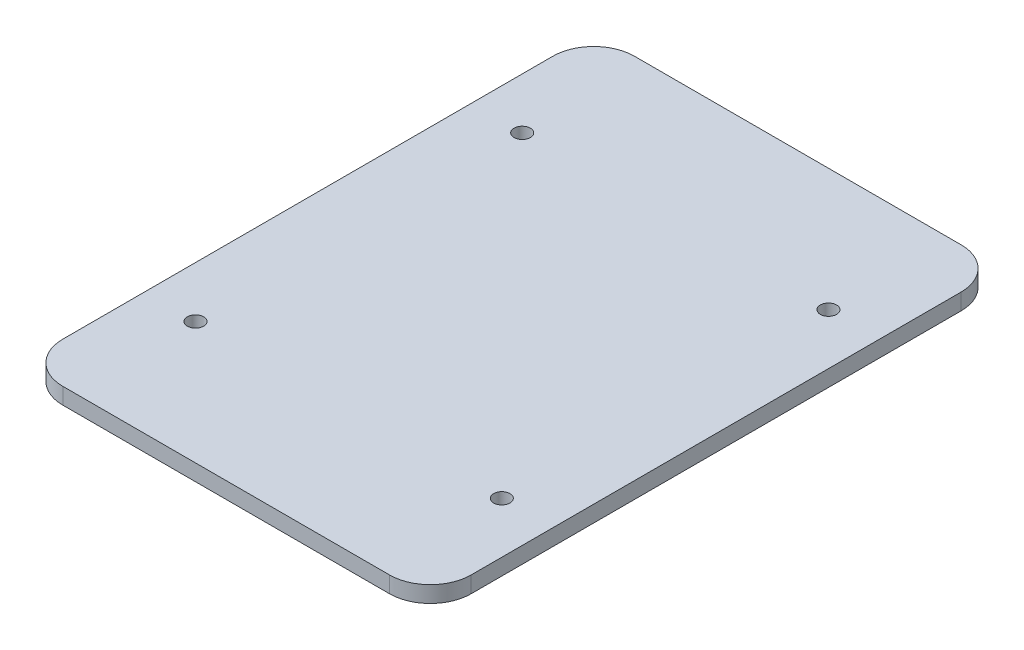
ISO-10303-21;
HEADER;
FILE_DESCRIPTION(('STEP AP214'),'2;1');
FILE_NAME('part.step','',(''),(''),'','','');
FILE_SCHEMA(('AUTOMOTIVE_DESIGN { 1 0 10303 214 1 1 1 1 }'));
ENDSEC;
DATA;
#1=APPLICATION_CONTEXT('core data for automotive mechanical design processes');
#2=APPLICATION_PROTOCOL_DEFINITION('international standard','automotive_design',2000,#1);
#3=PRODUCT_CONTEXT('',#1,'mechanical');
#4=PRODUCT('Part','Part','',(#3));
#5=PRODUCT_RELATED_PRODUCT_CATEGORY('part','',(#4));
#6=PRODUCT_DEFINITION_FORMATION('','',#4);
#7=PRODUCT_DEFINITION_CONTEXT('part definition',#1,'design');
#8=PRODUCT_DEFINITION('design','',#6,#7);
#9=PRODUCT_DEFINITION_SHAPE('','',#8);
#10=(LENGTH_UNIT() NAMED_UNIT(*) SI_UNIT(.MILLI.,.METRE.));
#11=(NAMED_UNIT(*) PLANE_ANGLE_UNIT() SI_UNIT($,.RADIAN.));
#12=(NAMED_UNIT(*) SI_UNIT($,.STERADIAN.) SOLID_ANGLE_UNIT());
#13=UNCERTAINTY_MEASURE_WITH_UNIT(LENGTH_MEASURE(1.E-05),#10,'distance_accuracy_value','');
#14=(GEOMETRIC_REPRESENTATION_CONTEXT(3) GLOBAL_UNCERTAINTY_ASSIGNED_CONTEXT((#13)) GLOBAL_UNIT_ASSIGNED_CONTEXT((#10,
#11,#12)) REPRESENTATION_CONTEXT('',''));
#15=CARTESIAN_POINT('',(0.,0.,0.));
#16=DIRECTION('',(0.,0.,1.));
#17=DIRECTION('',(1.,0.,0.));
#18=AXIS2_PLACEMENT_3D('',#15,#16,#17);
#19=CARTESIAN_POINT('',(0.,4.,0.));
#20=DIRECTION('',(0.,-1.,0.));
#21=DIRECTION('',(0.,0.,-1.));
#22=AXIS2_PLACEMENT_3D('',#19,#20,#21);
#23=PLANE('',#22);
#24=DIRECTION('',(-1.,0.,0.));
#25=VECTOR('',#24,1.);
#26=CARTESIAN_POINT('',(-50.,4.,-70.));
#27=LINE('',#26,#25);
#28=CARTESIAN_POINT('',(40.,4.,-70.));
#29=VERTEX_POINT('',#28);
#30=CARTESIAN_POINT('',(-40.,4.,-70.));
#31=VERTEX_POINT('',#30);
#32=EDGE_CURVE('E176',#29,#31,#27,.T.);
#33=ORIENTED_EDGE('',*,*,#32,.T.);
#34=CARTESIAN_POINT('',(-40.,4.,-60.));
#35=DIRECTION('',(0.,-1.,0.));
#36=DIRECTION('',(0.,0.,-1.));
#37=AXIS2_PLACEMENT_3D('',#34,#35,#36);
#38=CIRCLE('',#37,10.);
#39=CARTESIAN_POINT('',(-50.,4.,-60.));
#40=VERTEX_POINT('',#39);
#41=EDGE_CURVE('E156',#31,#40,#38,.F.);
#42=ORIENTED_EDGE('',*,*,#41,.T.);
#43=DIRECTION('',(0.,0.,1.));
#44=VECTOR('',#43,1.);
#45=CARTESIAN_POINT('',(-50.,4.,70.));
#46=LINE('',#45,#44);
#47=CARTESIAN_POINT('',(-50.,4.,60.));
#48=VERTEX_POINT('',#47);
#49=EDGE_CURVE('E126',#40,#48,#46,.T.);
#50=ORIENTED_EDGE('',*,*,#49,.T.);
#51=CARTESIAN_POINT('',(-40.,4.,60.));
#52=DIRECTION('',(0.,-1.,0.));
#53=DIRECTION('',(0.,0.,-1.));
#54=AXIS2_PLACEMENT_3D('',#51,#52,#53);
#55=CIRCLE('',#54,10.);
#56=CARTESIAN_POINT('',(-40.,4.,70.));
#57=VERTEX_POINT('',#56);
#58=EDGE_CURVE('E62',#48,#57,#55,.F.);
#59=ORIENTED_EDGE('',*,*,#58,.T.);
#60=DIRECTION('',(1.,0.,0.));
#61=VECTOR('',#60,1.);
#62=CARTESIAN_POINT('',(-50.,4.,70.));
#63=LINE('',#62,#61);
#64=CARTESIAN_POINT('',(40.,4.,70.));
#65=VERTEX_POINT('',#64);
#66=EDGE_CURVE('E143',#57,#65,#63,.T.);
#67=ORIENTED_EDGE('',*,*,#66,.T.);
#68=CARTESIAN_POINT('',(40.,4.,60.));
#69=DIRECTION('',(0.,-1.,0.));
#70=DIRECTION('',(0.,0.,-1.));
#71=AXIS2_PLACEMENT_3D('',#68,#69,#70);
#72=CIRCLE('',#71,10.);
#73=CARTESIAN_POINT('',(50.,4.,60.));
#74=VERTEX_POINT('',#73);
#75=EDGE_CURVE('E151',#65,#74,#72,.F.);
#76=ORIENTED_EDGE('',*,*,#75,.T.);
#77=DIRECTION('',(0.,0.,-1.));
#78=VECTOR('',#77,1.);
#79=CARTESIAN_POINT('',(50.,4.,70.));
#80=LINE('',#79,#78);
#81=CARTESIAN_POINT('',(50.,4.,-60.));
#82=VERTEX_POINT('',#81);
#83=EDGE_CURVE('E137',#74,#82,#80,.T.);
#84=ORIENTED_EDGE('',*,*,#83,.T.);
#85=CARTESIAN_POINT('',(40.,4.,-60.));
#86=DIRECTION('',(0.,-1.,0.));
#87=DIRECTION('',(0.,0.,-1.));
#88=AXIS2_PLACEMENT_3D('',#85,#86,#87);
#89=CIRCLE('',#88,10.);
#90=EDGE_CURVE('E154',#82,#29,#89,.F.);
#91=ORIENTED_EDGE('',*,*,#90,.T.);
#92=EDGE_LOOP('',(#33,#42,#50,#59,#67,#76,#84,#91));
#93=FACE_BOUND('',#92,.T.);
#94=CARTESIAN_POINT('',(-37.5,4.,-40.));
#95=DIRECTION('',(0.,1.,0.));
#96=DIRECTION('',(0.,0.,1.));
#97=AXIS2_PLACEMENT_3D('',#94,#95,#96);
#98=CIRCLE('',#97,2.);
#99=CARTESIAN_POINT('',(-37.5,4.,-38.));
#100=VERTEX_POINT('',#99);
#101=EDGE_CURVE('E182',#100,#100,#98,.T.);
#102=ORIENTED_EDGE('',*,*,#101,.F.);
#103=EDGE_LOOP('',(#102));
#104=FACE_BOUND('',#103,.T.);
#105=CARTESIAN_POINT('',(37.5,4.,-40.));
#106=DIRECTION('',(0.,1.,0.));
#107=DIRECTION('',(0.,0.,1.));
#108=AXIS2_PLACEMENT_3D('',#105,#106,#107);
#109=CIRCLE('',#108,2.);
#110=CARTESIAN_POINT('',(37.5,4.,-38.));
#111=VERTEX_POINT('',#110);
#112=EDGE_CURVE('E191',#111,#111,#109,.T.);
#113=ORIENTED_EDGE('',*,*,#112,.F.);
#114=EDGE_LOOP('',(#113));
#115=FACE_BOUND('',#114,.T.);
#116=CARTESIAN_POINT('',(37.5,4.,40.));
#117=DIRECTION('',(0.,1.,0.));
#118=DIRECTION('',(0.,0.,1.));
#119=AXIS2_PLACEMENT_3D('',#116,#117,#118);
#120=CIRCLE('',#119,2.);
#121=CARTESIAN_POINT('',(37.5,4.,42.));
#122=VERTEX_POINT('',#121);
#123=EDGE_CURVE('E196',#122,#122,#120,.T.);
#124=ORIENTED_EDGE('',*,*,#123,.F.);
#125=EDGE_LOOP('',(#124));
#126=FACE_BOUND('',#125,.T.);
#127=CARTESIAN_POINT('',(-37.5,4.,40.));
#128=DIRECTION('',(0.,1.,0.));
#129=DIRECTION('',(0.,0.,1.));
#130=AXIS2_PLACEMENT_3D('',#127,#128,#129);
#131=CIRCLE('',#130,2.);
#132=CARTESIAN_POINT('',(-37.5,4.,42.));
#133=VERTEX_POINT('',#132);
#134=EDGE_CURVE('E202',#133,#133,#131,.T.);
#135=ORIENTED_EDGE('',*,*,#134,.F.);
#136=EDGE_LOOP('',(#135));
#137=FACE_BOUND('',#136,.T.);
#138=ADVANCED_FACE('F41',(#93,#104,#115,#126,#137),#23,.F.);
#139=CARTESIAN_POINT('',(0.,0.,0.));
#140=DIRECTION('',(0.,-1.,0.));
#141=DIRECTION('',(0.,0.,-1.));
#142=AXIS2_PLACEMENT_3D('',#139,#140,#141);
#143=PLANE('',#142);
#144=CARTESIAN_POINT('',(37.5,0.,40.));
#145=DIRECTION('',(0.,1.,0.));
#146=DIRECTION('',(0.,0.,1.));
#147=AXIS2_PLACEMENT_3D('',#144,#145,#146);
#148=CIRCLE('',#147,2.);
#149=CARTESIAN_POINT('',(37.5,0.,42.));
#150=VERTEX_POINT('',#149);
#151=EDGE_CURVE('E199',#150,#150,#148,.T.);
#152=ORIENTED_EDGE('',*,*,#151,.T.);
#153=EDGE_LOOP('',(#152));
#154=FACE_BOUND('',#153,.T.);
#155=CARTESIAN_POINT('',(-37.5,0.,-40.));
#156=DIRECTION('',(0.,1.,0.));
#157=DIRECTION('',(0.,0.,1.));
#158=AXIS2_PLACEMENT_3D('',#155,#156,#157);
#159=CIRCLE('',#158,2.);
#160=CARTESIAN_POINT('',(-37.5,0.,-38.));
#161=VERTEX_POINT('',#160);
#162=EDGE_CURVE('E184',#161,#161,#159,.T.);
#163=ORIENTED_EDGE('',*,*,#162,.T.);
#164=EDGE_LOOP('',(#163));
#165=FACE_BOUND('',#164,.T.);
#166=DIRECTION('',(0.,0.,1.));
#167=VECTOR('',#166,1.);
#168=CARTESIAN_POINT('',(-50.,0.,70.));
#169=LINE('',#168,#167);
#170=CARTESIAN_POINT('',(-50.,0.,-60.));
#171=VERTEX_POINT('',#170);
#172=CARTESIAN_POINT('',(-50.,0.,60.));
#173=VERTEX_POINT('',#172);
#174=EDGE_CURVE('E124',#171,#173,#169,.T.);
#175=ORIENTED_EDGE('',*,*,#174,.F.);
#176=CARTESIAN_POINT('',(-40.,0.,-60.));
#177=DIRECTION('',(0.,-1.,0.));
#178=DIRECTION('',(0.,0.,-1.));
#179=AXIS2_PLACEMENT_3D('',#176,#177,#178);
#180=CIRCLE('',#179,10.);
#181=CARTESIAN_POINT('',(-40.,0.,-70.));
#182=VERTEX_POINT('',#181);
#183=EDGE_CURVE('E107',#171,#182,#180,.T.);
#184=ORIENTED_EDGE('',*,*,#183,.T.);
#185=DIRECTION('',(-1.,0.,0.));
#186=VECTOR('',#185,1.);
#187=CARTESIAN_POINT('',(-50.,0.,-70.));
#188=LINE('',#187,#186);
#189=CARTESIAN_POINT('',(40.,0.,-70.));
#190=VERTEX_POINT('',#189);
#191=EDGE_CURVE('E135',#190,#182,#188,.T.);
#192=ORIENTED_EDGE('',*,*,#191,.F.);
#193=CARTESIAN_POINT('',(40.,0.,-60.));
#194=DIRECTION('',(0.,-1.,0.));
#195=DIRECTION('',(0.,0.,-1.));
#196=AXIS2_PLACEMENT_3D('',#193,#194,#195);
#197=CIRCLE('',#196,10.);
#198=CARTESIAN_POINT('',(50.,0.,-60.));
#199=VERTEX_POINT('',#198);
#200=EDGE_CURVE('E118',#190,#199,#197,.T.);
#201=ORIENTED_EDGE('',*,*,#200,.T.);
#202=DIRECTION('',(0.,0.,-1.));
#203=VECTOR('',#202,1.);
#204=CARTESIAN_POINT('',(50.,0.,70.));
#205=LINE('',#204,#203);
#206=CARTESIAN_POINT('',(50.,0.,60.));
#207=VERTEX_POINT('',#206);
#208=EDGE_CURVE('E139',#207,#199,#205,.T.);
#209=ORIENTED_EDGE('',*,*,#208,.F.);
#210=CARTESIAN_POINT('',(40.,0.,60.));
#211=DIRECTION('',(0.,-1.,0.));
#212=DIRECTION('',(0.,0.,-1.));
#213=AXIS2_PLACEMENT_3D('',#210,#211,#212);
#214=CIRCLE('',#213,10.);
#215=CARTESIAN_POINT('',(40.,0.,70.));
#216=VERTEX_POINT('',#215);
#217=EDGE_CURVE('E127',#207,#216,#214,.T.);
#218=ORIENTED_EDGE('',*,*,#217,.T.);
#219=DIRECTION('',(1.,0.,0.));
#220=VECTOR('',#219,1.);
#221=CARTESIAN_POINT('',(-50.,0.,70.));
#222=LINE('',#221,#220);
#223=CARTESIAN_POINT('',(-40.,0.,70.));
#224=VERTEX_POINT('',#223);
#225=EDGE_CURVE('E134',#224,#216,#222,.T.);
#226=ORIENTED_EDGE('',*,*,#225,.F.);
#227=CARTESIAN_POINT('',(-40.,0.,60.));
#228=DIRECTION('',(0.,-1.,0.));
#229=DIRECTION('',(0.,0.,-1.));
#230=AXIS2_PLACEMENT_3D('',#227,#228,#229);
#231=CIRCLE('',#230,10.);
#232=EDGE_CURVE('E133',#224,#173,#231,.T.);
#233=ORIENTED_EDGE('',*,*,#232,.T.);
#234=EDGE_LOOP('',(#175,#184,#192,#201,#209,#218,#226,#233));
#235=FACE_BOUND('',#234,.T.);
#236=CARTESIAN_POINT('',(37.5,0.,-40.));
#237=DIRECTION('',(0.,1.,0.));
#238=DIRECTION('',(0.,0.,1.));
#239=AXIS2_PLACEMENT_3D('',#236,#237,#238);
#240=CIRCLE('',#239,2.);
#241=CARTESIAN_POINT('',(37.5,0.,-38.));
#242=VERTEX_POINT('',#241);
#243=EDGE_CURVE('E193',#242,#242,#240,.T.);
#244=ORIENTED_EDGE('',*,*,#243,.T.);
#245=EDGE_LOOP('',(#244));
#246=FACE_BOUND('',#245,.T.);
#247=CARTESIAN_POINT('',(-37.5,0.,40.));
#248=DIRECTION('',(0.,1.,0.));
#249=DIRECTION('',(0.,0.,1.));
#250=AXIS2_PLACEMENT_3D('',#247,#248,#249);
#251=CIRCLE('',#250,2.);
#252=CARTESIAN_POINT('',(-37.5,0.,42.));
#253=VERTEX_POINT('',#252);
#254=EDGE_CURVE('E205',#253,#253,#251,.T.);
#255=ORIENTED_EDGE('',*,*,#254,.T.);
#256=EDGE_LOOP('',(#255));
#257=FACE_BOUND('',#256,.T.);
#258=ADVANCED_FACE('F130',(#154,#165,#235,#246,#257),#143,.T.);
#259=CARTESIAN_POINT('',(50.,4.,70.));
#260=DIRECTION('',(-1.,0.,0.));
#261=DIRECTION('',(0.,0.,1.));
#262=AXIS2_PLACEMENT_3D('',#259,#260,#261);
#263=PLANE('',#262);
#264=ORIENTED_EDGE('',*,*,#208,.T.);
#265=DIRECTION('',(0.,-1.,0.));
#266=VECTOR('',#265,1.);
#267=CARTESIAN_POINT('',(50.,4.,-60.));
#268=LINE('',#267,#266);
#269=EDGE_CURVE('E161',#199,#82,#268,.F.);
#270=ORIENTED_EDGE('',*,*,#269,.T.);
#271=ORIENTED_EDGE('',*,*,#83,.F.);
#272=DIRECTION('',(0.,-1.,0.));
#273=VECTOR('',#272,1.);
#274=CARTESIAN_POINT('',(50.,4.,60.));
#275=LINE('',#274,#273);
#276=EDGE_CURVE('E158',#74,#207,#275,.T.);
#277=ORIENTED_EDGE('',*,*,#276,.T.);
#278=EDGE_LOOP('',(#264,#270,#271,#277));
#279=FACE_BOUND('',#278,.T.);
#280=ADVANCED_FACE('F167',(#279),#263,.F.);
#281=CARTESIAN_POINT('',(-50.,4.,-70.));
#282=DIRECTION('',(0.,0.,1.));
#283=DIRECTION('',(1.,0.,0.));
#284=AXIS2_PLACEMENT_3D('',#281,#282,#283);
#285=PLANE('',#284);
#286=ORIENTED_EDGE('',*,*,#191,.T.);
#287=DIRECTION('',(0.,-1.,0.));
#288=VECTOR('',#287,1.);
#289=CARTESIAN_POINT('',(-40.,4.,-70.));
#290=LINE('',#289,#288);
#291=EDGE_CURVE('E112',#182,#31,#290,.F.);
#292=ORIENTED_EDGE('',*,*,#291,.T.);
#293=ORIENTED_EDGE('',*,*,#32,.F.);
#294=DIRECTION('',(0.,-1.,0.));
#295=VECTOR('',#294,1.);
#296=CARTESIAN_POINT('',(40.,4.,-70.));
#297=LINE('',#296,#295);
#298=EDGE_CURVE('E117',#29,#190,#297,.T.);
#299=ORIENTED_EDGE('',*,*,#298,.T.);
#300=EDGE_LOOP('',(#286,#292,#293,#299));
#301=FACE_BOUND('',#300,.T.);
#302=ADVANCED_FACE('F181',(#301),#285,.F.);
#303=CARTESIAN_POINT('',(-50.,4.,70.));
#304=DIRECTION('',(1.,0.,0.));
#305=DIRECTION('',(0.,0.,-1.));
#306=AXIS2_PLACEMENT_3D('',#303,#304,#305);
#307=PLANE('',#306);
#308=ORIENTED_EDGE('',*,*,#49,.F.);
#309=DIRECTION('',(0.,-1.,0.));
#310=VECTOR('',#309,1.);
#311=CARTESIAN_POINT('',(-50.,4.,-60.));
#312=LINE('',#311,#310);
#313=EDGE_CURVE('E111',#40,#171,#312,.T.);
#314=ORIENTED_EDGE('',*,*,#313,.T.);
#315=ORIENTED_EDGE('',*,*,#174,.T.);
#316=DIRECTION('',(0.,-1.,0.));
#317=VECTOR('',#316,1.);
#318=CARTESIAN_POINT('',(-50.,4.,60.));
#319=LINE('',#318,#317);
#320=EDGE_CURVE('E128',#173,#48,#319,.F.);
#321=ORIENTED_EDGE('',*,*,#320,.T.);
#322=EDGE_LOOP('',(#308,#314,#315,#321));
#323=FACE_BOUND('',#322,.T.);
#324=ADVANCED_FACE('F123',(#323),#307,.F.);
#325=CARTESIAN_POINT('',(-50.,4.,70.));
#326=DIRECTION('',(0.,0.,-1.));
#327=DIRECTION('',(-1.,0.,0.));
#328=AXIS2_PLACEMENT_3D('',#325,#326,#327);
#329=PLANE('',#328);
#330=ORIENTED_EDGE('',*,*,#66,.F.);
#331=DIRECTION('',(0.,-1.,0.));
#332=VECTOR('',#331,1.);
#333=CARTESIAN_POINT('',(-40.,4.,70.));
#334=LINE('',#333,#332);
#335=EDGE_CURVE('E11',#57,#224,#334,.T.);
#336=ORIENTED_EDGE('',*,*,#335,.T.);
#337=ORIENTED_EDGE('',*,*,#225,.T.);
#338=DIRECTION('',(0.,-1.,0.));
#339=VECTOR('',#338,1.);
#340=CARTESIAN_POINT('',(40.,4.,70.));
#341=LINE('',#340,#339);
#342=EDGE_CURVE('E49',#216,#65,#341,.F.);
#343=ORIENTED_EDGE('',*,*,#342,.T.);
#344=EDGE_LOOP('',(#330,#336,#337,#343));
#345=FACE_BOUND('',#344,.T.);
#346=ADVANCED_FACE('F226',(#345),#329,.F.);
#347=CARTESIAN_POINT('',(-37.5,4.,-40.));
#348=DIRECTION('',(0.,-1.,0.));
#349=DIRECTION('',(0.,0.,-1.));
#350=AXIS2_PLACEMENT_3D('',#347,#348,#349);
#351=CYLINDRICAL_SURFACE('',#350,2.);
#352=ORIENTED_EDGE('',*,*,#101,.T.);
#353=EDGE_LOOP('',(#352));
#354=FACE_BOUND('',#353,.T.);
#355=ORIENTED_EDGE('',*,*,#162,.F.);
#356=EDGE_LOOP('',(#355));
#357=FACE_BOUND('',#356,.T.);
#358=ADVANCED_FACE('F223',(#354,#357),#351,.F.);
#359=CARTESIAN_POINT('',(37.5,4.,-40.));
#360=DIRECTION('',(0.,-1.,0.));
#361=DIRECTION('',(0.,0.,-1.));
#362=AXIS2_PLACEMENT_3D('',#359,#360,#361);
#363=CYLINDRICAL_SURFACE('',#362,2.);
#364=ORIENTED_EDGE('',*,*,#112,.T.);
#365=EDGE_LOOP('',(#364));
#366=FACE_BOUND('',#365,.T.);
#367=ORIENTED_EDGE('',*,*,#243,.F.);
#368=EDGE_LOOP('',(#367));
#369=FACE_BOUND('',#368,.T.);
#370=ADVANCED_FACE('F282',(#366,#369),#363,.F.);
#371=CARTESIAN_POINT('',(37.5,4.,40.));
#372=DIRECTION('',(0.,-1.,0.));
#373=DIRECTION('',(0.,0.,-1.));
#374=AXIS2_PLACEMENT_3D('',#371,#372,#373);
#375=CYLINDRICAL_SURFACE('',#374,2.);
#376=ORIENTED_EDGE('',*,*,#123,.T.);
#377=EDGE_LOOP('',(#376));
#378=FACE_BOUND('',#377,.T.);
#379=ORIENTED_EDGE('',*,*,#151,.F.);
#380=EDGE_LOOP('',(#379));
#381=FACE_BOUND('',#380,.T.);
#382=ADVANCED_FACE('F273',(#378,#381),#375,.F.);
#383=CARTESIAN_POINT('',(-37.5,4.,40.));
#384=DIRECTION('',(0.,-1.,0.));
#385=DIRECTION('',(0.,0.,-1.));
#386=AXIS2_PLACEMENT_3D('',#383,#384,#385);
#387=CYLINDRICAL_SURFACE('',#386,2.);
#388=ORIENTED_EDGE('',*,*,#134,.T.);
#389=EDGE_LOOP('',(#388));
#390=FACE_BOUND('',#389,.T.);
#391=ORIENTED_EDGE('',*,*,#254,.F.);
#392=EDGE_LOOP('',(#391));
#393=FACE_BOUND('',#392,.T.);
#394=ADVANCED_FACE('F211',(#390,#393),#387,.F.);
#395=CARTESIAN_POINT('',(-40.,4.,-60.));
#396=DIRECTION('',(0.,-1.,0.));
#397=DIRECTION('',(0.,0.,-1.));
#398=AXIS2_PLACEMENT_3D('',#395,#396,#397);
#399=CYLINDRICAL_SURFACE('',#398,10.);
#400=ORIENTED_EDGE('',*,*,#41,.F.);
#401=ORIENTED_EDGE('',*,*,#291,.F.);
#402=ORIENTED_EDGE('',*,*,#183,.F.);
#403=ORIENTED_EDGE('',*,*,#313,.F.);
#404=EDGE_LOOP('',(#400,#401,#402,#403));
#405=FACE_BOUND('',#404,.T.);
#406=ADVANCED_FACE('F110',(#405),#399,.T.);
#407=CARTESIAN_POINT('',(40.,4.,-60.));
#408=DIRECTION('',(0.,-1.,0.));
#409=DIRECTION('',(0.,0.,-1.));
#410=AXIS2_PLACEMENT_3D('',#407,#408,#409);
#411=CYLINDRICAL_SURFACE('',#410,10.);
#412=ORIENTED_EDGE('',*,*,#90,.F.);
#413=ORIENTED_EDGE('',*,*,#269,.F.);
#414=ORIENTED_EDGE('',*,*,#200,.F.);
#415=ORIENTED_EDGE('',*,*,#298,.F.);
#416=EDGE_LOOP('',(#412,#413,#414,#415));
#417=FACE_BOUND('',#416,.T.);
#418=ADVANCED_FACE('F179',(#417),#411,.T.);
#419=CARTESIAN_POINT('',(-40.,4.,60.));
#420=DIRECTION('',(0.,-1.,0.));
#421=DIRECTION('',(0.,0.,-1.));
#422=AXIS2_PLACEMENT_3D('',#419,#420,#421);
#423=CYLINDRICAL_SURFACE('',#422,10.);
#424=ORIENTED_EDGE('',*,*,#58,.F.);
#425=ORIENTED_EDGE('',*,*,#320,.F.);
#426=ORIENTED_EDGE('',*,*,#232,.F.);
#427=ORIENTED_EDGE('',*,*,#335,.F.);
#428=EDGE_LOOP('',(#424,#425,#426,#427));
#429=FACE_BOUND('',#428,.T.);
#430=ADVANCED_FACE('F238',(#429),#423,.T.);
#431=CARTESIAN_POINT('',(40.,4.,60.));
#432=DIRECTION('',(0.,-1.,0.));
#433=DIRECTION('',(0.,0.,-1.));
#434=AXIS2_PLACEMENT_3D('',#431,#432,#433);
#435=CYLINDRICAL_SURFACE('',#434,10.);
#436=ORIENTED_EDGE('',*,*,#75,.F.);
#437=ORIENTED_EDGE('',*,*,#342,.F.);
#438=ORIENTED_EDGE('',*,*,#217,.F.);
#439=ORIENTED_EDGE('',*,*,#276,.F.);
#440=EDGE_LOOP('',(#436,#437,#438,#439));
#441=FACE_BOUND('',#440,.T.);
#442=ADVANCED_FACE('F43',(#441),#435,.T.);
#443=CLOSED_SHELL('',(#138,#258,#280,#302,#324,#346,#358,#370,#382,#394,#406,#418,#430,#442));
#444=MANIFOLD_SOLID_BREP('B2',#443);
#445=ADVANCED_BREP_SHAPE_REPRESENTATION('',(#18,#444),#14);
#446=SHAPE_DEFINITION_REPRESENTATION(#9,#445);
ENDSEC;
END-ISO-10303-21;
